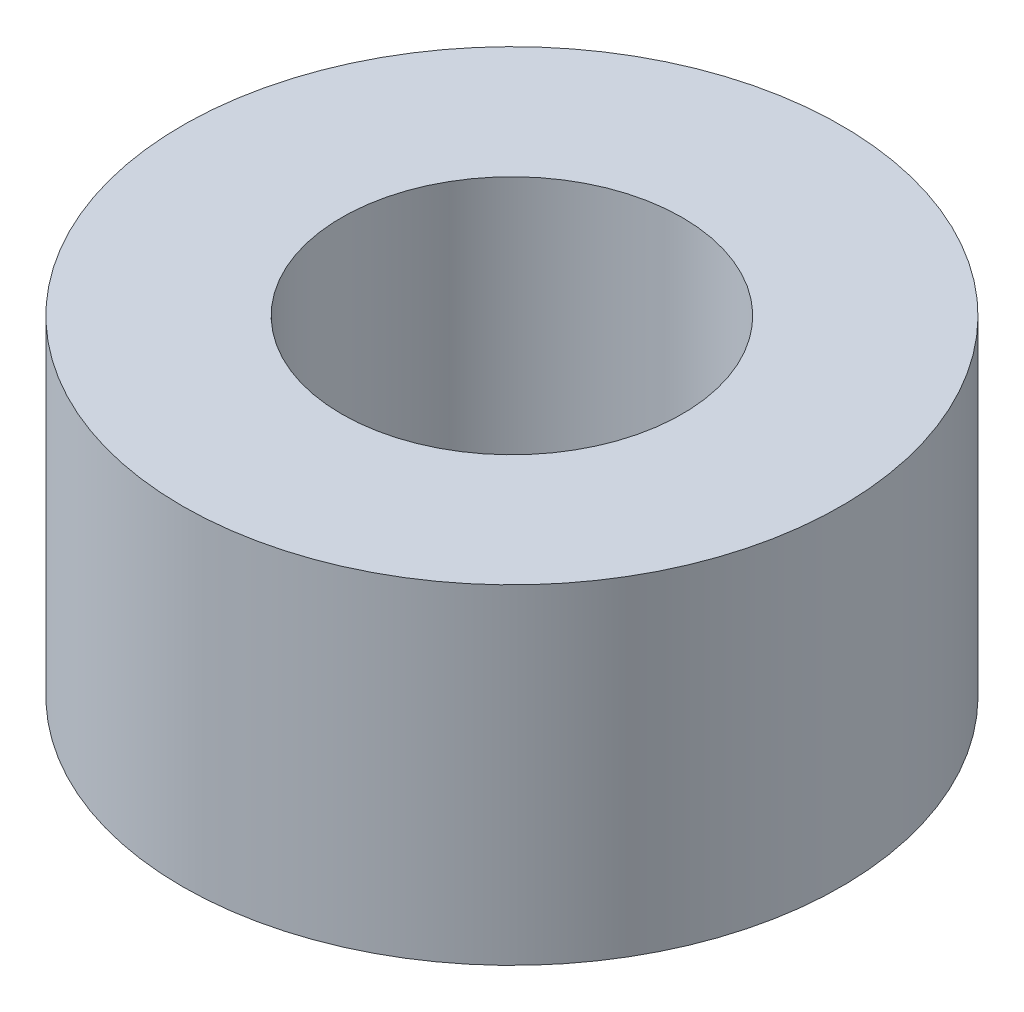
ISO-10303-21;
HEADER;
FILE_DESCRIPTION(('STEP AP214'),'2;1');
FILE_NAME('part.step','',(''),(''),'','','');
FILE_SCHEMA(('AUTOMOTIVE_DESIGN { 1 0 10303 214 1 1 1 1 }'));
ENDSEC;
DATA;
#1=APPLICATION_CONTEXT('core data for automotive mechanical design processes');
#2=APPLICATION_PROTOCOL_DEFINITION('international standard','automotive_design',2000,#1);
#3=PRODUCT_CONTEXT('',#1,'mechanical');
#4=PRODUCT('Part','Part','',(#3));
#5=PRODUCT_RELATED_PRODUCT_CATEGORY('part','',(#4));
#6=PRODUCT_DEFINITION_FORMATION('','',#4);
#7=PRODUCT_DEFINITION_CONTEXT('part definition',#1,'design');
#8=PRODUCT_DEFINITION('design','',#6,#7);
#9=PRODUCT_DEFINITION_SHAPE('','',#8);
#10=(LENGTH_UNIT() NAMED_UNIT(*) SI_UNIT(.MILLI.,.METRE.));
#11=(NAMED_UNIT(*) PLANE_ANGLE_UNIT() SI_UNIT($,.RADIAN.));
#12=(NAMED_UNIT(*) SI_UNIT($,.STERADIAN.) SOLID_ANGLE_UNIT());
#13=UNCERTAINTY_MEASURE_WITH_UNIT(LENGTH_MEASURE(1.E-05),#10,'distance_accuracy_value','');
#14=(GEOMETRIC_REPRESENTATION_CONTEXT(3) GLOBAL_UNCERTAINTY_ASSIGNED_CONTEXT((#13)) GLOBAL_UNIT_ASSIGNED_CONTEXT((#10,
#11,#12)) REPRESENTATION_CONTEXT('',''));
#15=CARTESIAN_POINT('',(0.,0.,0.));
#16=DIRECTION('',(0.,0.,1.));
#17=DIRECTION('',(1.,0.,0.));
#18=AXIS2_PLACEMENT_3D('',#15,#16,#17);
#19=CARTESIAN_POINT('',(0.,3.,0.));
#20=DIRECTION('',(0.,1.,0.));
#21=DIRECTION('',(0.,0.,1.));
#22=AXIS2_PLACEMENT_3D('',#19,#20,#21);
#23=PLANE('',#22);
#24=CARTESIAN_POINT('',(0.,3.,0.));
#25=DIRECTION('',(0.,1.,0.));
#26=DIRECTION('',(0.,0.,1.));
#27=AXIS2_PLACEMENT_3D('',#24,#25,#26);
#28=CIRCLE('',#27,3.);
#29=CARTESIAN_POINT('',(0.,3.,3.));
#30=VERTEX_POINT('',#29);
#31=EDGE_CURVE('E10',#30,#30,#28,.T.);
#32=ORIENTED_EDGE('',*,*,#31,.T.);
#33=EDGE_LOOP('',(#32));
#34=FACE_BOUND('',#33,.T.);
#35=CARTESIAN_POINT('',(0.,3.,0.));
#36=DIRECTION('',(0.,1.,0.));
#37=DIRECTION('',(0.,0.,1.));
#38=AXIS2_PLACEMENT_3D('',#35,#36,#37);
#39=CIRCLE('',#38,1.55);
#40=CARTESIAN_POINT('',(0.,3.,1.55));
#41=VERTEX_POINT('',#40);
#42=EDGE_CURVE('E42',#41,#41,#39,.T.);
#43=ORIENTED_EDGE('',*,*,#42,.F.);
#44=EDGE_LOOP('',(#43));
#45=FACE_BOUND('',#44,.T.);
#46=ADVANCED_FACE('F31',(#34,#45),#23,.T.);
#47=CARTESIAN_POINT('',(0.,0.,0.));
#48=DIRECTION('',(0.,1.,0.));
#49=DIRECTION('',(0.,0.,1.));
#50=AXIS2_PLACEMENT_3D('',#47,#48,#49);
#51=PLANE('',#50);
#52=CARTESIAN_POINT('',(0.,0.,0.));
#53=DIRECTION('',(0.,1.,0.));
#54=DIRECTION('',(0.,0.,1.));
#55=AXIS2_PLACEMENT_3D('',#52,#53,#54);
#56=CIRCLE('',#55,3.);
#57=CARTESIAN_POINT('',(0.,0.,3.));
#58=VERTEX_POINT('',#57);
#59=EDGE_CURVE('E35',#58,#58,#56,.T.);
#60=ORIENTED_EDGE('',*,*,#59,.F.);
#61=EDGE_LOOP('',(#60));
#62=FACE_BOUND('',#61,.T.);
#63=CARTESIAN_POINT('',(0.,0.,0.));
#64=DIRECTION('',(0.,1.,0.));
#65=DIRECTION('',(0.,0.,1.));
#66=AXIS2_PLACEMENT_3D('',#63,#64,#65);
#67=CIRCLE('',#66,1.55);
#68=CARTESIAN_POINT('',(0.,0.,1.55));
#69=VERTEX_POINT('',#68);
#70=EDGE_CURVE('E44',#69,#69,#67,.T.);
#71=ORIENTED_EDGE('',*,*,#70,.T.);
#72=EDGE_LOOP('',(#71));
#73=FACE_BOUND('',#72,.T.);
#74=ADVANCED_FACE('F54',(#62,#73),#51,.F.);
#75=CARTESIAN_POINT('',(0.,3.,0.));
#76=DIRECTION('',(0.,-1.,0.));
#77=DIRECTION('',(0.,0.,-1.));
#78=AXIS2_PLACEMENT_3D('',#75,#76,#77);
#79=CYLINDRICAL_SURFACE('',#78,3.);
#80=ORIENTED_EDGE('',*,*,#31,.F.);
#81=EDGE_LOOP('',(#80));
#82=FACE_BOUND('',#81,.T.);
#83=ORIENTED_EDGE('',*,*,#59,.T.);
#84=EDGE_LOOP('',(#83));
#85=FACE_BOUND('',#84,.T.);
#86=ADVANCED_FACE('F33',(#82,#85),#79,.T.);
#87=CARTESIAN_POINT('',(0.,3.,0.));
#88=DIRECTION('',(0.,-1.,0.));
#89=DIRECTION('',(0.,0.,-1.));
#90=AXIS2_PLACEMENT_3D('',#87,#88,#89);
#91=CYLINDRICAL_SURFACE('',#90,1.55);
#92=ORIENTED_EDGE('',*,*,#42,.T.);
#93=EDGE_LOOP('',(#92));
#94=FACE_BOUND('',#93,.T.);
#95=ORIENTED_EDGE('',*,*,#70,.F.);
#96=EDGE_LOOP('',(#95));
#97=FACE_BOUND('',#96,.T.);
#98=ADVANCED_FACE('F50',(#94,#97),#91,.F.);
#99=CLOSED_SHELL('',(#46,#74,#86,#98));
#100=MANIFOLD_SOLID_BREP('B2',#99);
#101=ADVANCED_BREP_SHAPE_REPRESENTATION('',(#18,#100),#14);
#102=SHAPE_DEFINITION_REPRESENTATION(#9,#101);
ENDSEC;
END-ISO-10303-21;
